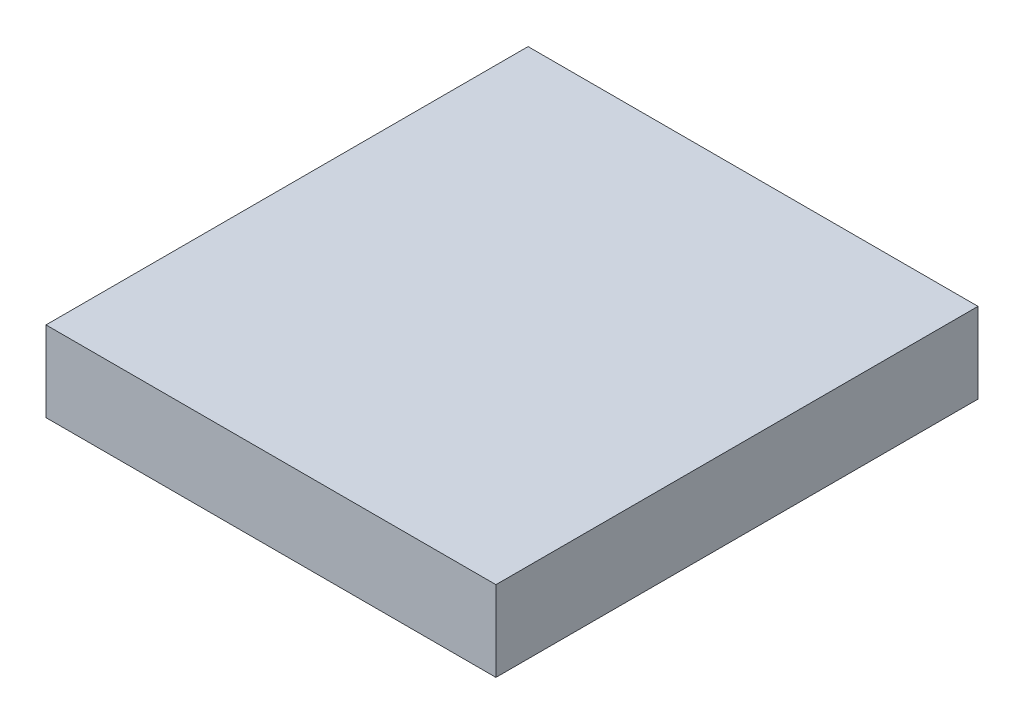
ISO-10303-21;
HEADER;
FILE_DESCRIPTION(('STEP AP214'),'2;1');
FILE_NAME('part.step','',(''),(''),'','','');
FILE_SCHEMA(('AUTOMOTIVE_DESIGN { 1 0 10303 214 1 1 1 1 }'));
ENDSEC;
DATA;
#1=APPLICATION_CONTEXT('core data for automotive mechanical design processes');
#2=APPLICATION_PROTOCOL_DEFINITION('international standard','automotive_design',2000,#1);
#3=PRODUCT_CONTEXT('',#1,'mechanical');
#4=PRODUCT('Part','Part','',(#3));
#5=PRODUCT_RELATED_PRODUCT_CATEGORY('part','',(#4));
#6=PRODUCT_DEFINITION_FORMATION('','',#4);
#7=PRODUCT_DEFINITION_CONTEXT('part definition',#1,'design');
#8=PRODUCT_DEFINITION('design','',#6,#7);
#9=PRODUCT_DEFINITION_SHAPE('','',#8);
#10=(LENGTH_UNIT() NAMED_UNIT(*) SI_UNIT(.MILLI.,.METRE.));
#11=(NAMED_UNIT(*) PLANE_ANGLE_UNIT() SI_UNIT($,.RADIAN.));
#12=(NAMED_UNIT(*) SI_UNIT($,.STERADIAN.) SOLID_ANGLE_UNIT());
#13=UNCERTAINTY_MEASURE_WITH_UNIT(LENGTH_MEASURE(1.E-05),#10,'distance_accuracy_value','');
#14=(GEOMETRIC_REPRESENTATION_CONTEXT(3) GLOBAL_UNCERTAINTY_ASSIGNED_CONTEXT((#13)) GLOBAL_UNIT_ASSIGNED_CONTEXT((#10,
#11,#12)) REPRESENTATION_CONTEXT('',''));
#15=CARTESIAN_POINT('',(0.,0.,0.));
#16=DIRECTION('',(0.,0.,1.));
#17=DIRECTION('',(1.,0.,0.));
#18=AXIS2_PLACEMENT_3D('',#15,#16,#17);
#19=CARTESIAN_POINT('',(0.,5.,0.));
#20=DIRECTION('',(1.,0.,0.));
#21=DIRECTION('',(0.,0.,-1.));
#22=AXIS2_PLACEMENT_3D('',#19,#20,#21);
#23=PLANE('',#22);
#24=DIRECTION('',(0.,0.,1.));
#25=VECTOR('',#24,1.);
#26=CARTESIAN_POINT('',(0.,0.,0.));
#27=LINE('',#26,#25);
#28=CARTESIAN_POINT('',(0.,0.,-30.));
#29=VERTEX_POINT('',#28);
#30=CARTESIAN_POINT('',(0.,0.,0.));
#31=VERTEX_POINT('',#30);
#32=EDGE_CURVE('E115',#29,#31,#27,.T.);
#33=ORIENTED_EDGE('',*,*,#32,.T.);
#34=DIRECTION('',(0.,-1.,0.));
#35=VECTOR('',#34,1.);
#36=CARTESIAN_POINT('',(0.,5.,0.));
#37=LINE('',#36,#35);
#38=CARTESIAN_POINT('',(0.,5.,0.));
#39=VERTEX_POINT('',#38);
#40=EDGE_CURVE('E11',#39,#31,#37,.T.);
#41=ORIENTED_EDGE('',*,*,#40,.F.);
#42=DIRECTION('',(0.,0.,1.));
#43=VECTOR('',#42,1.);
#44=CARTESIAN_POINT('',(0.,5.,0.));
#45=LINE('',#44,#43);
#46=CARTESIAN_POINT('',(0.,5.,-30.));
#47=VERTEX_POINT('',#46);
#48=EDGE_CURVE('E99',#47,#39,#45,.T.);
#49=ORIENTED_EDGE('',*,*,#48,.F.);
#50=DIRECTION('',(0.,-1.,0.));
#51=VECTOR('',#50,1.);
#52=CARTESIAN_POINT('',(0.,5.,-30.));
#53=LINE('',#52,#51);
#54=EDGE_CURVE('E111',#47,#29,#53,.T.);
#55=ORIENTED_EDGE('',*,*,#54,.T.);
#56=EDGE_LOOP('',(#33,#41,#49,#55));
#57=FACE_BOUND('',#56,.T.);
#58=ADVANCED_FACE('F47',(#57),#23,.F.);
#59=CARTESIAN_POINT('',(0.,5.,0.));
#60=DIRECTION('',(0.,0.,-1.));
#61=DIRECTION('',(-1.,0.,0.));
#62=AXIS2_PLACEMENT_3D('',#59,#60,#61);
#63=PLANE('',#62);
#64=DIRECTION('',(1.,0.,0.));
#65=VECTOR('',#64,1.);
#66=CARTESIAN_POINT('',(0.,0.,0.));
#67=LINE('',#66,#65);
#68=CARTESIAN_POINT('',(28.,0.,0.));
#69=VERTEX_POINT('',#68);
#70=EDGE_CURVE('E104',#31,#69,#67,.T.);
#71=ORIENTED_EDGE('',*,*,#70,.T.);
#72=DIRECTION('',(0.,-1.,0.));
#73=VECTOR('',#72,1.);
#74=CARTESIAN_POINT('',(28.,5.,0.));
#75=LINE('',#74,#73);
#76=CARTESIAN_POINT('',(28.,5.,0.));
#77=VERTEX_POINT('',#76);
#78=EDGE_CURVE('E56',#77,#69,#75,.T.);
#79=ORIENTED_EDGE('',*,*,#78,.F.);
#80=DIRECTION('',(1.,0.,0.));
#81=VECTOR('',#80,1.);
#82=CARTESIAN_POINT('',(0.,5.,0.));
#83=LINE('',#82,#81);
#84=EDGE_CURVE('E94',#39,#77,#83,.T.);
#85=ORIENTED_EDGE('',*,*,#84,.F.);
#86=ORIENTED_EDGE('',*,*,#40,.T.);
#87=EDGE_LOOP('',(#71,#79,#85,#86));
#88=FACE_BOUND('',#87,.T.);
#89=ADVANCED_FACE('F103',(#88),#63,.F.);
#90=CARTESIAN_POINT('',(28.,5.,0.));
#91=DIRECTION('',(-1.,0.,0.));
#92=DIRECTION('',(0.,0.,1.));
#93=AXIS2_PLACEMENT_3D('',#90,#91,#92);
#94=PLANE('',#93);
#95=DIRECTION('',(0.,0.,-1.));
#96=VECTOR('',#95,1.);
#97=CARTESIAN_POINT('',(28.,0.,0.));
#98=LINE('',#97,#96);
#99=CARTESIAN_POINT('',(28.,0.,-30.));
#100=VERTEX_POINT('',#99);
#101=EDGE_CURVE('E81',#69,#100,#98,.T.);
#102=ORIENTED_EDGE('',*,*,#101,.T.);
#103=DIRECTION('',(0.,-1.,0.));
#104=VECTOR('',#103,1.);
#105=CARTESIAN_POINT('',(28.,5.,-30.));
#106=LINE('',#105,#104);
#107=CARTESIAN_POINT('',(28.,5.,-30.));
#108=VERTEX_POINT('',#107);
#109=EDGE_CURVE('E106',#108,#100,#106,.T.);
#110=ORIENTED_EDGE('',*,*,#109,.F.);
#111=DIRECTION('',(0.,0.,-1.));
#112=VECTOR('',#111,1.);
#113=CARTESIAN_POINT('',(28.,5.,0.));
#114=LINE('',#113,#112);
#115=EDGE_CURVE('E97',#77,#108,#114,.T.);
#116=ORIENTED_EDGE('',*,*,#115,.F.);
#117=ORIENTED_EDGE('',*,*,#78,.T.);
#118=EDGE_LOOP('',(#102,#110,#116,#117));
#119=FACE_BOUND('',#118,.T.);
#120=ADVANCED_FACE('F107',(#119),#94,.F.);
#121=CARTESIAN_POINT('',(0.,5.,-30.));
#122=DIRECTION('',(0.,0.,1.));
#123=DIRECTION('',(1.,0.,0.));
#124=AXIS2_PLACEMENT_3D('',#121,#122,#123);
#125=PLANE('',#124);
#126=DIRECTION('',(-1.,0.,0.));
#127=VECTOR('',#126,1.);
#128=CARTESIAN_POINT('',(0.,0.,-30.));
#129=LINE('',#128,#127);
#130=EDGE_CURVE('E87',#100,#29,#129,.T.);
#131=ORIENTED_EDGE('',*,*,#130,.T.);
#132=ORIENTED_EDGE('',*,*,#54,.F.);
#133=DIRECTION('',(-1.,0.,0.));
#134=VECTOR('',#133,1.);
#135=CARTESIAN_POINT('',(0.,5.,-30.));
#136=LINE('',#135,#134);
#137=EDGE_CURVE('E64',#108,#47,#136,.T.);
#138=ORIENTED_EDGE('',*,*,#137,.F.);
#139=ORIENTED_EDGE('',*,*,#109,.T.);
#140=EDGE_LOOP('',(#131,#132,#138,#139));
#141=FACE_BOUND('',#140,.T.);
#142=ADVANCED_FACE('F128',(#141),#125,.F.);
#143=CARTESIAN_POINT('',(0.,5.,0.));
#144=DIRECTION('',(0.,-1.,0.));
#145=DIRECTION('',(0.,0.,-1.));
#146=AXIS2_PLACEMENT_3D('',#143,#144,#145);
#147=PLANE('',#146);
#148=ORIENTED_EDGE('',*,*,#48,.T.);
#149=ORIENTED_EDGE('',*,*,#84,.T.);
#150=ORIENTED_EDGE('',*,*,#115,.T.);
#151=ORIENTED_EDGE('',*,*,#137,.T.);
#152=EDGE_LOOP('',(#148,#149,#150,#151));
#153=FACE_BOUND('',#152,.T.);
#154=ADVANCED_FACE('F95',(#153),#147,.F.);
#155=CARTESIAN_POINT('',(0.,0.,0.));
#156=DIRECTION('',(0.,-1.,0.));
#157=DIRECTION('',(0.,0.,-1.));
#158=AXIS2_PLACEMENT_3D('',#155,#156,#157);
#159=PLANE('',#158);
#160=ORIENTED_EDGE('',*,*,#32,.F.);
#161=ORIENTED_EDGE('',*,*,#130,.F.);
#162=ORIENTED_EDGE('',*,*,#101,.F.);
#163=ORIENTED_EDGE('',*,*,#70,.F.);
#164=EDGE_LOOP('',(#160,#161,#162,#163));
#165=FACE_BOUND('',#164,.T.);
#166=ADVANCED_FACE('F131',(#165),#159,.T.);
#167=CLOSED_SHELL('',(#58,#89,#120,#142,#154,#166));
#168=MANIFOLD_SOLID_BREP('B2',#167);
#169=ADVANCED_BREP_SHAPE_REPRESENTATION('',(#18,#168),#14);
#170=SHAPE_DEFINITION_REPRESENTATION(#9,#169);
ENDSEC;
END-ISO-10303-21;
